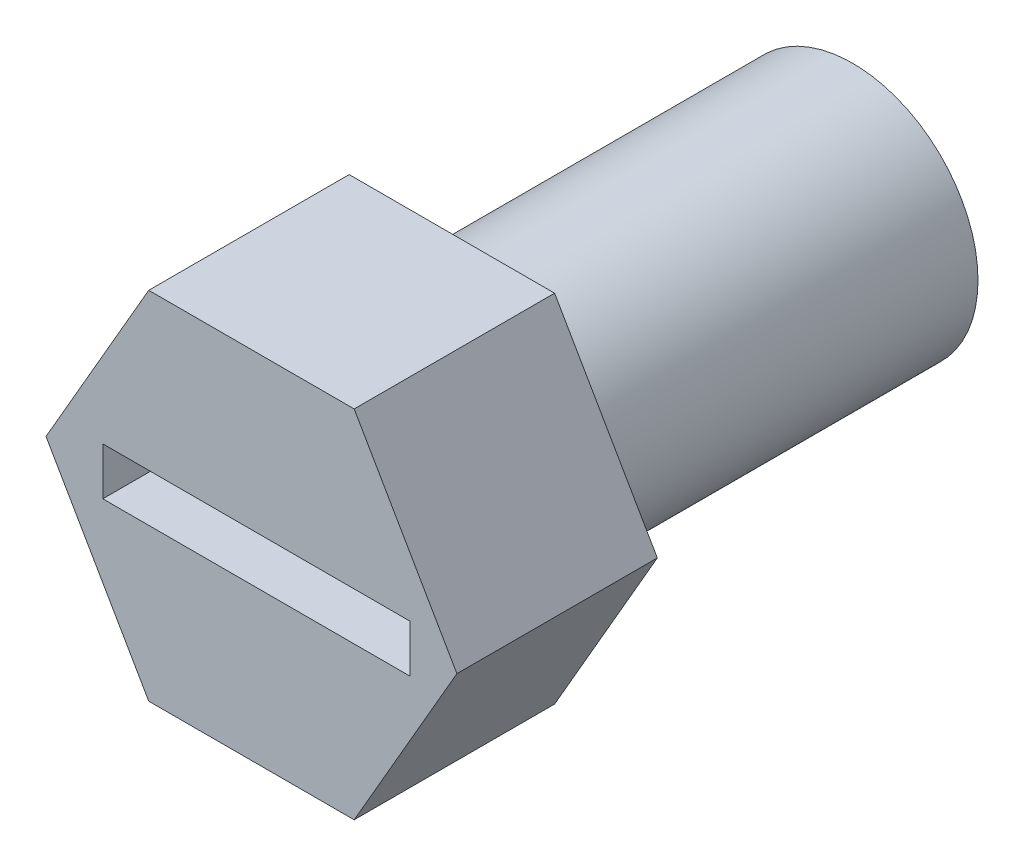
ISO-10303-21;
HEADER;
FILE_DESCRIPTION(('STEP AP214'),'2;1');
FILE_NAME('part.step','',(''),(''),'','','');
FILE_SCHEMA(('AUTOMOTIVE_DESIGN { 1 0 10303 214 1 1 1 1 }'));
ENDSEC;
DATA;
#1=APPLICATION_CONTEXT('core data for automotive mechanical design processes');
#2=APPLICATION_PROTOCOL_DEFINITION('international standard','automotive_design',2000,#1);
#3=PRODUCT_CONTEXT('',#1,'mechanical');
#4=PRODUCT('Part','Part','',(#3));
#5=PRODUCT_RELATED_PRODUCT_CATEGORY('part','',(#4));
#6=PRODUCT_DEFINITION_FORMATION('','',#4);
#7=PRODUCT_DEFINITION_CONTEXT('part definition',#1,'design');
#8=PRODUCT_DEFINITION('design','',#6,#7);
#9=PRODUCT_DEFINITION_SHAPE('','',#8);
#10=(LENGTH_UNIT() NAMED_UNIT(*) SI_UNIT(.MILLI.,.METRE.));
#11=(NAMED_UNIT(*) PLANE_ANGLE_UNIT() SI_UNIT($,.RADIAN.));
#12=(NAMED_UNIT(*) SI_UNIT($,.STERADIAN.) SOLID_ANGLE_UNIT());
#13=UNCERTAINTY_MEASURE_WITH_UNIT(LENGTH_MEASURE(1.E-05),#10,'distance_accuracy_value','');
#14=(GEOMETRIC_REPRESENTATION_CONTEXT(3) GLOBAL_UNCERTAINTY_ASSIGNED_CONTEXT((#13)) GLOBAL_UNIT_ASSIGNED_CONTEXT((#10,
#11,#12)) REPRESENTATION_CONTEXT('',''));
#15=CARTESIAN_POINT('',(0.,0.,0.));
#16=DIRECTION('',(0.,0.,1.));
#17=DIRECTION('',(1.,0.,0.));
#18=AXIS2_PLACEMENT_3D('',#15,#16,#17);
#19=CARTESIAN_POINT('',(0.,0.,40.));
#20=DIRECTION('',(0.,0.,-1.));
#21=DIRECTION('',(-1.,0.,0.));
#22=AXIS2_PLACEMENT_3D('',#19,#20,#21);
#23=CYLINDRICAL_SURFACE('',#22,12.5);
#24=CARTESIAN_POINT('',(0.,0.,40.));
#25=DIRECTION('',(0.,0.,1.));
#26=DIRECTION('',(1.,0.,0.));
#27=AXIS2_PLACEMENT_3D('',#24,#25,#26);
#28=CIRCLE('',#27,12.5);
#29=CARTESIAN_POINT('',(12.5,0.,40.));
#30=VERTEX_POINT('',#29);
#31=EDGE_CURVE('E11',#30,#30,#28,.T.);
#32=ORIENTED_EDGE('',*,*,#31,.F.);
#33=EDGE_LOOP('',(#32));
#34=FACE_BOUND('',#33,.T.);
#35=CARTESIAN_POINT('',(0.,0.,0.));
#36=DIRECTION('',(0.,0.,1.));
#37=DIRECTION('',(1.,0.,0.));
#38=AXIS2_PLACEMENT_3D('',#35,#36,#37);
#39=CIRCLE('',#38,12.5);
#40=CARTESIAN_POINT('',(12.5,0.,0.));
#41=VERTEX_POINT('',#40);
#42=EDGE_CURVE('E38',#41,#41,#39,.T.);
#43=ORIENTED_EDGE('',*,*,#42,.T.);
#44=EDGE_LOOP('',(#43));
#45=FACE_BOUND('',#44,.T.);
#46=ADVANCED_FACE('F35',(#34,#45),#23,.T.);
#47=CARTESIAN_POINT('',(0.,0.,0.));
#48=DIRECTION('',(0.,0.,1.));
#49=DIRECTION('',(1.,0.,0.));
#50=AXIS2_PLACEMENT_3D('',#47,#48,#49);
#51=PLANE('',#50);
#52=ORIENTED_EDGE('',*,*,#42,.F.);
#53=EDGE_LOOP('',(#52));
#54=FACE_BOUND('',#53,.T.);
#55=ADVANCED_FACE('F157',(#54),#51,.F.);
#56=CARTESIAN_POINT('',(0.,0.,40.));
#57=DIRECTION('',(0.,0.,1.));
#58=DIRECTION('',(1.,0.,0.));
#59=AXIS2_PLACEMENT_3D('',#56,#57,#58);
#60=PLANE('',#59);
#61=DIRECTION('',(0.499999999999995,0.866025403784441,0.));
#62=VECTOR('',#61,1.);
#63=CARTESIAN_POINT('',(10.2505991358113,-17.7545585112464,40.));
#64=LINE('',#63,#62);
#65=CARTESIAN_POINT('',(10.2505991358113,-17.7545585112464,40.));
#66=VERTEX_POINT('',#65);
#67=CARTESIAN_POINT('',(20.5011982716222,0.,40.));
#68=VERTEX_POINT('',#67);
#69=EDGE_CURVE('E132',#66,#68,#64,.T.);
#70=ORIENTED_EDGE('',*,*,#69,.F.);
#71=DIRECTION('',(1.,0.,0.));
#72=VECTOR('',#71,1.);
#73=CARTESIAN_POINT('',(-10.250599135811,-17.7545585112466,40.));
#74=LINE('',#73,#72);
#75=CARTESIAN_POINT('',(-10.250599135811,-17.7545585112466,40.));
#76=VERTEX_POINT('',#75);
#77=EDGE_CURVE('E85',#76,#66,#74,.T.);
#78=ORIENTED_EDGE('',*,*,#77,.F.);
#79=DIRECTION('',(0.500000000000007,-0.866025403784435,0.));
#80=VECTOR('',#79,1.);
#81=CARTESIAN_POINT('',(-20.5011982716222,-1.43159102378584E-13,40.));
#82=LINE('',#81,#80);
#83=CARTESIAN_POINT('',(-20.5011982716222,-1.43159102378584E-13,40.));
#84=VERTEX_POINT('',#83);
#85=EDGE_CURVE('E141',#84,#76,#82,.T.);
#86=ORIENTED_EDGE('',*,*,#85,.F.);
#87=DIRECTION('',(-0.499999999999995,-0.866025403784442,0.));
#88=VECTOR('',#87,1.);
#89=CARTESIAN_POINT('',(-10.2505991358112,17.7545585112464,40.));
#90=LINE('',#89,#88);
#91=CARTESIAN_POINT('',(-10.2505991358112,17.7545585112464,40.));
#92=VERTEX_POINT('',#91);
#93=EDGE_CURVE('E120',#92,#84,#90,.T.);
#94=ORIENTED_EDGE('',*,*,#93,.F.);
#95=DIRECTION('',(-1.,0.,0.));
#96=VECTOR('',#95,1.);
#97=CARTESIAN_POINT('',(10.2505991358111,17.7545585112465,40.));
#98=LINE('',#97,#96);
#99=CARTESIAN_POINT('',(10.2505991358111,17.7545585112465,40.));
#100=VERTEX_POINT('',#99);
#101=EDGE_CURVE('E138',#100,#92,#98,.T.);
#102=ORIENTED_EDGE('',*,*,#101,.F.);
#103=DIRECTION('',(-0.500000000000001,0.866025403784438,0.));
#104=VECTOR('',#103,1.);
#105=CARTESIAN_POINT('',(20.5011982716222,0.,40.));
#106=LINE('',#105,#104);
#107=EDGE_CURVE('E135',#68,#100,#106,.T.);
#108=ORIENTED_EDGE('',*,*,#107,.F.);
#109=EDGE_LOOP('',(#70,#78,#86,#94,#102,#108));
#110=FACE_BOUND('',#109,.T.);
#111=ORIENTED_EDGE('',*,*,#31,.T.);
#112=EDGE_LOOP('',(#111));
#113=FACE_BOUND('',#112,.T.);
#114=ADVANCED_FACE('F159',(#110,#113),#60,.F.);
#115=CARTESIAN_POINT('',(10.2505991358113,-17.7545585112464,60.));
#116=DIRECTION('',(-0.866025403784442,0.499999999999995,0.));
#117=DIRECTION('',(-0.499999999999995,-0.866025403784442,0.));
#118=AXIS2_PLACEMENT_3D('',#115,#116,#117);
#119=PLANE('',#118);
#120=ORIENTED_EDGE('',*,*,#69,.T.);
#121=DIRECTION('',(0.,0.,-1.));
#122=VECTOR('',#121,1.);
#123=CARTESIAN_POINT('',(20.5011982716222,0.,60.));
#124=LINE('',#123,#122);
#125=CARTESIAN_POINT('',(20.5011982716222,0.,60.));
#126=VERTEX_POINT('',#125);
#127=EDGE_CURVE('E151',#126,#68,#124,.T.);
#128=ORIENTED_EDGE('',*,*,#127,.F.);
#129=DIRECTION('',(0.499999999999995,0.866025403784441,0.));
#130=VECTOR('',#129,1.);
#131=CARTESIAN_POINT('',(10.2505991358113,-17.7545585112464,60.));
#132=LINE('',#131,#130);
#133=CARTESIAN_POINT('',(10.2505991358113,-17.7545585112464,60.));
#134=VERTEX_POINT('',#133);
#135=EDGE_CURVE('E144',#134,#126,#132,.T.);
#136=ORIENTED_EDGE('',*,*,#135,.F.);
#137=DIRECTION('',(0.,0.,-1.));
#138=VECTOR('',#137,1.);
#139=CARTESIAN_POINT('',(10.2505991358113,-17.7545585112464,60.));
#140=LINE('',#139,#138);
#141=EDGE_CURVE('E128',#134,#66,#140,.T.);
#142=ORIENTED_EDGE('',*,*,#141,.T.);
#143=EDGE_LOOP('',(#120,#128,#136,#142));
#144=FACE_BOUND('',#143,.T.);
#145=ADVANCED_FACE('F164',(#144),#119,.F.);
#146=CARTESIAN_POINT('',(20.5011982716222,0.,60.));
#147=DIRECTION('',(-0.866025403784438,-0.500000000000001,0.));
#148=DIRECTION('',(0.500000000000001,-0.866025403784438,0.));
#149=AXIS2_PLACEMENT_3D('',#146,#147,#148);
#150=PLANE('',#149);
#151=ORIENTED_EDGE('',*,*,#107,.T.);
#152=DIRECTION('',(0.,0.,-1.));
#153=VECTOR('',#152,1.);
#154=CARTESIAN_POINT('',(10.2505991358111,17.7545585112465,60.));
#155=LINE('',#154,#153);
#156=CARTESIAN_POINT('',(10.2505991358111,17.7545585112465,60.));
#157=VERTEX_POINT('',#156);
#158=EDGE_CURVE('E148',#157,#100,#155,.T.);
#159=ORIENTED_EDGE('',*,*,#158,.F.);
#160=DIRECTION('',(-0.500000000000001,0.866025403784438,0.));
#161=VECTOR('',#160,1.);
#162=CARTESIAN_POINT('',(20.5011982716222,0.,60.));
#163=LINE('',#162,#161);
#164=EDGE_CURVE('E94',#126,#157,#163,.T.);
#165=ORIENTED_EDGE('',*,*,#164,.F.);
#166=ORIENTED_EDGE('',*,*,#127,.T.);
#167=EDGE_LOOP('',(#151,#159,#165,#166));
#168=FACE_BOUND('',#167,.T.);
#169=ADVANCED_FACE('F171',(#168),#150,.F.);
#170=CARTESIAN_POINT('',(10.2505991358111,17.7545585112465,60.));
#171=DIRECTION('',(0.,-1.,0.));
#172=DIRECTION('',(1.,0.,0.));
#173=AXIS2_PLACEMENT_3D('',#170,#171,#172);
#174=PLANE('',#173);
#175=ORIENTED_EDGE('',*,*,#101,.T.);
#176=DIRECTION('',(0.,0.,-1.));
#177=VECTOR('',#176,1.);
#178=CARTESIAN_POINT('',(-10.2505991358112,17.7545585112464,60.));
#179=LINE('',#178,#177);
#180=CARTESIAN_POINT('',(-10.2505991358112,17.7545585112464,60.));
#181=VERTEX_POINT('',#180);
#182=EDGE_CURVE('E123',#181,#92,#179,.T.);
#183=ORIENTED_EDGE('',*,*,#182,.F.);
#184=DIRECTION('',(-1.,0.,0.));
#185=VECTOR('',#184,1.);
#186=CARTESIAN_POINT('',(10.2505991358111,17.7545585112465,60.));
#187=LINE('',#186,#185);
#188=EDGE_CURVE('E111',#157,#181,#187,.T.);
#189=ORIENTED_EDGE('',*,*,#188,.F.);
#190=ORIENTED_EDGE('',*,*,#158,.T.);
#191=EDGE_LOOP('',(#175,#183,#189,#190));
#192=FACE_BOUND('',#191,.T.);
#193=ADVANCED_FACE('F175',(#192),#174,.F.);
#194=CARTESIAN_POINT('',(-10.2505991358112,17.7545585112464,60.));
#195=DIRECTION('',(0.866025403784442,-0.499999999999995,0.));
#196=DIRECTION('',(0.499999999999995,0.866025403784442,0.));
#197=AXIS2_PLACEMENT_3D('',#194,#195,#196);
#198=PLANE('',#197);
#199=ORIENTED_EDGE('',*,*,#93,.T.);
#200=DIRECTION('',(0.,0.,-1.));
#201=VECTOR('',#200,1.);
#202=CARTESIAN_POINT('',(-20.5011982716222,-1.43159102378584E-13,60.));
#203=LINE('',#202,#201);
#204=CARTESIAN_POINT('',(-20.5011982716222,-1.43159102378584E-13,60.));
#205=VERTEX_POINT('',#204);
#206=EDGE_CURVE('E117',#205,#84,#203,.T.);
#207=ORIENTED_EDGE('',*,*,#206,.F.);
#208=DIRECTION('',(-0.499999999999995,-0.866025403784442,0.));
#209=VECTOR('',#208,1.);
#210=CARTESIAN_POINT('',(-10.2505991358112,17.7545585112464,60.));
#211=LINE('',#210,#209);
#212=EDGE_CURVE('E104',#181,#205,#211,.T.);
#213=ORIENTED_EDGE('',*,*,#212,.F.);
#214=ORIENTED_EDGE('',*,*,#182,.T.);
#215=EDGE_LOOP('',(#199,#207,#213,#214));
#216=FACE_BOUND('',#215,.T.);
#217=ADVANCED_FACE('F118',(#216),#198,.F.);
#218=CARTESIAN_POINT('',(-20.5011982716222,-1.43159102378584E-13,60.));
#219=DIRECTION('',(0.866025403784434,0.500000000000007,0.));
#220=DIRECTION('',(-0.500000000000007,0.866025403784435,0.));
#221=AXIS2_PLACEMENT_3D('',#218,#219,#220);
#222=PLANE('',#221);
#223=ORIENTED_EDGE('',*,*,#85,.T.);
#224=DIRECTION('',(0.,0.,-1.));
#225=VECTOR('',#224,1.);
#226=CARTESIAN_POINT('',(-10.250599135811,-17.7545585112466,60.));
#227=LINE('',#226,#225);
#228=CARTESIAN_POINT('',(-10.250599135811,-17.7545585112466,60.));
#229=VERTEX_POINT('',#228);
#230=EDGE_CURVE('E124',#229,#76,#227,.T.);
#231=ORIENTED_EDGE('',*,*,#230,.F.);
#232=DIRECTION('',(0.500000000000007,-0.866025403784435,0.));
#233=VECTOR('',#232,1.);
#234=CARTESIAN_POINT('',(-20.5011982716222,-1.43159102378584E-13,60.));
#235=LINE('',#234,#233);
#236=EDGE_CURVE('E108',#205,#229,#235,.T.);
#237=ORIENTED_EDGE('',*,*,#236,.F.);
#238=ORIENTED_EDGE('',*,*,#206,.T.);
#239=EDGE_LOOP('',(#223,#231,#237,#238));
#240=FACE_BOUND('',#239,.T.);
#241=ADVANCED_FACE('F126',(#240),#222,.F.);
#242=CARTESIAN_POINT('',(-10.250599135811,-17.7545585112466,60.));
#243=DIRECTION('',(0.,1.,0.));
#244=DIRECTION('',(-1.,0.,0.));
#245=AXIS2_PLACEMENT_3D('',#242,#243,#244);
#246=PLANE('',#245);
#247=ORIENTED_EDGE('',*,*,#77,.T.);
#248=ORIENTED_EDGE('',*,*,#141,.F.);
#249=DIRECTION('',(1.,0.,0.));
#250=VECTOR('',#249,1.);
#251=CARTESIAN_POINT('',(-10.250599135811,-17.7545585112466,60.));
#252=LINE('',#251,#250);
#253=EDGE_CURVE('E58',#229,#134,#252,.T.);
#254=ORIENTED_EDGE('',*,*,#253,.F.);
#255=ORIENTED_EDGE('',*,*,#230,.T.);
#256=EDGE_LOOP('',(#247,#248,#254,#255));
#257=FACE_BOUND('',#256,.T.);
#258=ADVANCED_FACE('F183',(#257),#246,.F.);
#259=CARTESIAN_POINT('',(0.,0.,60.));
#260=DIRECTION('',(0.,0.,1.));
#261=DIRECTION('',(1.,0.,0.));
#262=AXIS2_PLACEMENT_3D('',#259,#260,#261);
#263=PLANE('',#262);
#264=DIRECTION('',(0.,-1.,0.));
#265=VECTOR('',#264,1.);
#266=CARTESIAN_POINT('',(-14.8334794054209,2.19621903818192,60.));
#267=LINE('',#266,#265);
#268=CARTESIAN_POINT('',(-14.8334794054209,2.19621903818192,60.));
#269=VERTEX_POINT('',#268);
#270=CARTESIAN_POINT('',(-14.8334794054209,-2.55625494607916,60.));
#271=VERTEX_POINT('',#270);
#272=EDGE_CURVE('E49',#269,#271,#267,.T.);
#273=ORIENTED_EDGE('',*,*,#272,.F.);
#274=DIRECTION('',(-1.,0.,0.));
#275=VECTOR('',#274,1.);
#276=CARTESIAN_POINT('',(-14.8334794054209,2.19621903818192,60.));
#277=LINE('',#276,#275);
#278=CARTESIAN_POINT('',(15.8415799475369,2.19621903818192,60.));
#279=VERTEX_POINT('',#278);
#280=EDGE_CURVE('E222',#279,#269,#277,.T.);
#281=ORIENTED_EDGE('',*,*,#280,.F.);
#282=DIRECTION('',(0.,1.,0.));
#283=VECTOR('',#282,1.);
#284=CARTESIAN_POINT('',(15.8415799475369,2.19621903818192,60.));
#285=LINE('',#284,#283);
#286=CARTESIAN_POINT('',(15.8415799475369,-2.55625494607916,60.));
#287=VERTEX_POINT('',#286);
#288=EDGE_CURVE('E227',#287,#279,#285,.T.);
#289=ORIENTED_EDGE('',*,*,#288,.F.);
#290=DIRECTION('',(1.,0.,0.));
#291=VECTOR('',#290,1.);
#292=CARTESIAN_POINT('',(-14.8334794054209,-2.55625494607916,60.));
#293=LINE('',#292,#291);
#294=EDGE_CURVE('E234',#271,#287,#293,.T.);
#295=ORIENTED_EDGE('',*,*,#294,.F.);
#296=EDGE_LOOP('',(#273,#281,#289,#295));
#297=FACE_BOUND('',#296,.T.);
#298=ORIENTED_EDGE('',*,*,#135,.T.);
#299=ORIENTED_EDGE('',*,*,#164,.T.);
#300=ORIENTED_EDGE('',*,*,#188,.T.);
#301=ORIENTED_EDGE('',*,*,#212,.T.);
#302=ORIENTED_EDGE('',*,*,#236,.T.);
#303=ORIENTED_EDGE('',*,*,#253,.T.);
#304=EDGE_LOOP('',(#298,#299,#300,#301,#302,#303));
#305=FACE_BOUND('',#304,.T.);
#306=ADVANCED_FACE('F106',(#297,#305),#263,.T.);
#307=CARTESIAN_POINT('',(-14.8334794054209,2.19621903818192,45.));
#308=DIRECTION('',(-1.,0.,0.));
#309=DIRECTION('',(0.,0.,1.));
#310=AXIS2_PLACEMENT_3D('',#307,#308,#309);
#311=PLANE('',#310);
#312=ORIENTED_EDGE('',*,*,#272,.T.);
#313=DIRECTION('',(0.,0.,1.));
#314=VECTOR('',#313,1.);
#315=CARTESIAN_POINT('',(-14.8334794054209,-2.55625494607916,45.));
#316=LINE('',#315,#314);
#317=CARTESIAN_POINT('',(-14.8334794054209,-2.55625494607916,45.));
#318=VERTEX_POINT('',#317);
#319=EDGE_CURVE('E232',#318,#271,#316,.T.);
#320=ORIENTED_EDGE('',*,*,#319,.F.);
#321=DIRECTION('',(0.,-1.,0.));
#322=VECTOR('',#321,1.);
#323=CARTESIAN_POINT('',(-14.8334794054209,2.19621903818192,45.));
#324=LINE('',#323,#322);
#325=CARTESIAN_POINT('',(-14.8334794054209,2.19621903818192,45.));
#326=VERTEX_POINT('',#325);
#327=EDGE_CURVE('E214',#326,#318,#324,.T.);
#328=ORIENTED_EDGE('',*,*,#327,.F.);
#329=DIRECTION('',(0.,0.,1.));
#330=VECTOR('',#329,1.);
#331=CARTESIAN_POINT('',(-14.8334794054209,2.19621903818192,45.));
#332=LINE('',#331,#330);
#333=EDGE_CURVE('E136',#326,#269,#332,.T.);
#334=ORIENTED_EDGE('',*,*,#333,.T.);
#335=EDGE_LOOP('',(#312,#320,#328,#334));
#336=FACE_BOUND('',#335,.T.);
#337=ADVANCED_FACE('F188',(#336),#311,.F.);
#338=CARTESIAN_POINT('',(-14.8334794054209,2.19621903818192,45.));
#339=DIRECTION('',(0.,1.,0.));
#340=DIRECTION('',(0.,0.,1.));
#341=AXIS2_PLACEMENT_3D('',#338,#339,#340);
#342=PLANE('',#341);
#343=ORIENTED_EDGE('',*,*,#280,.T.);
#344=ORIENTED_EDGE('',*,*,#333,.F.);
#345=DIRECTION('',(-1.,0.,0.));
#346=VECTOR('',#345,1.);
#347=CARTESIAN_POINT('',(-14.8334794054209,2.19621903818192,45.));
#348=LINE('',#347,#346);
#349=CARTESIAN_POINT('',(15.8415799475369,2.19621903818192,45.));
#350=VERTEX_POINT('',#349);
#351=EDGE_CURVE('E220',#350,#326,#348,.T.);
#352=ORIENTED_EDGE('',*,*,#351,.F.);
#353=DIRECTION('',(0.,0.,1.));
#354=VECTOR('',#353,1.);
#355=CARTESIAN_POINT('',(15.8415799475369,2.19621903818192,45.));
#356=LINE('',#355,#354);
#357=EDGE_CURVE('E240',#350,#279,#356,.T.);
#358=ORIENTED_EDGE('',*,*,#357,.T.);
#359=EDGE_LOOP('',(#343,#344,#352,#358));
#360=FACE_BOUND('',#359,.T.);
#361=ADVANCED_FACE('F192',(#360),#342,.F.);
#362=CARTESIAN_POINT('',(15.8415799475369,2.19621903818192,45.));
#363=DIRECTION('',(1.,0.,0.));
#364=DIRECTION('',(0.,0.,-1.));
#365=AXIS2_PLACEMENT_3D('',#362,#363,#364);
#366=PLANE('',#365);
#367=ORIENTED_EDGE('',*,*,#288,.T.);
#368=ORIENTED_EDGE('',*,*,#357,.F.);
#369=DIRECTION('',(0.,1.,0.));
#370=VECTOR('',#369,1.);
#371=CARTESIAN_POINT('',(15.8415799475369,2.19621903818192,45.));
#372=LINE('',#371,#370);
#373=CARTESIAN_POINT('',(15.8415799475369,-2.55625494607916,45.));
#374=VERTEX_POINT('',#373);
#375=EDGE_CURVE('E224',#374,#350,#372,.T.);
#376=ORIENTED_EDGE('',*,*,#375,.F.);
#377=DIRECTION('',(0.,0.,1.));
#378=VECTOR('',#377,1.);
#379=CARTESIAN_POINT('',(15.8415799475369,-2.55625494607916,45.));
#380=LINE('',#379,#378);
#381=EDGE_CURVE('E243',#374,#287,#380,.T.);
#382=ORIENTED_EDGE('',*,*,#381,.T.);
#383=EDGE_LOOP('',(#367,#368,#376,#382));
#384=FACE_BOUND('',#383,.T.);
#385=ADVANCED_FACE('F197',(#384),#366,.F.);
#386=CARTESIAN_POINT('',(-14.8334794054209,-2.55625494607916,45.));
#387=DIRECTION('',(0.,-1.,0.));
#388=DIRECTION('',(0.,0.,-1.));
#389=AXIS2_PLACEMENT_3D('',#386,#387,#388);
#390=PLANE('',#389);
#391=ORIENTED_EDGE('',*,*,#294,.T.);
#392=ORIENTED_EDGE('',*,*,#381,.F.);
#393=DIRECTION('',(1.,0.,0.));
#394=VECTOR('',#393,1.);
#395=CARTESIAN_POINT('',(-14.8334794054209,-2.55625494607916,45.));
#396=LINE('',#395,#394);
#397=EDGE_CURVE('E218',#318,#374,#396,.T.);
#398=ORIENTED_EDGE('',*,*,#397,.F.);
#399=ORIENTED_EDGE('',*,*,#319,.T.);
#400=EDGE_LOOP('',(#391,#392,#398,#399));
#401=FACE_BOUND('',#400,.T.);
#402=ADVANCED_FACE('F193',(#401),#390,.F.);
#403=CARTESIAN_POINT('',(0.,0.,45.));
#404=DIRECTION('',(0.,0.,1.));
#405=DIRECTION('',(1.,0.,0.));
#406=AXIS2_PLACEMENT_3D('',#403,#404,#405);
#407=PLANE('',#406);
#408=ORIENTED_EDGE('',*,*,#327,.T.);
#409=ORIENTED_EDGE('',*,*,#397,.T.);
#410=ORIENTED_EDGE('',*,*,#375,.T.);
#411=ORIENTED_EDGE('',*,*,#351,.T.);
#412=EDGE_LOOP('',(#408,#409,#410,#411));
#413=FACE_BOUND('',#412,.T.);
#414=ADVANCED_FACE('F196',(#413),#407,.T.);
#415=CLOSED_SHELL('',(#46,#55,#114,#145,#169,#193,#217,#241,#258,#306,#337,#361,#385,#402,#414));
#416=MANIFOLD_SOLID_BREP('B2',#415);
#417=ADVANCED_BREP_SHAPE_REPRESENTATION('',(#18,#416),#14);
#418=SHAPE_DEFINITION_REPRESENTATION(#9,#417);
ENDSEC;
END-ISO-10303-21;
